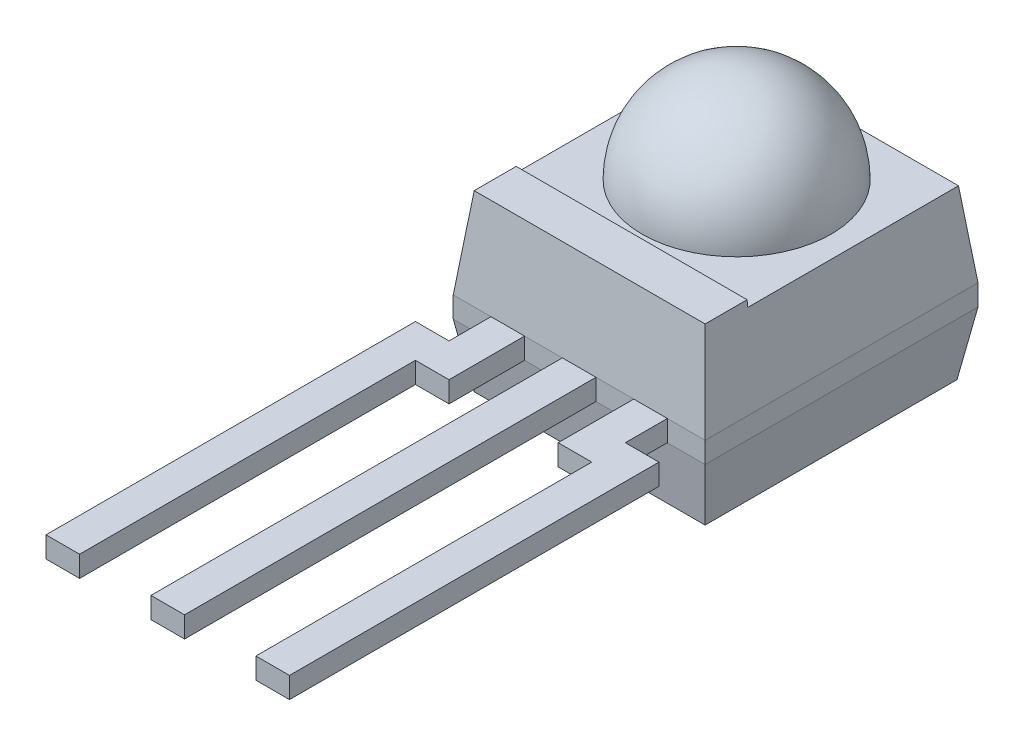
ISO-10303-21;
HEADER;
FILE_DESCRIPTION(('STEP AP214'),'2;1');
FILE_NAME('part.step','',(''),(''),'','','');
FILE_SCHEMA(('AUTOMOTIVE_DESIGN { 1 0 10303 214 1 1 1 1 }'));
ENDSEC;
DATA;
#1=APPLICATION_CONTEXT('core data for automotive mechanical design processes');
#2=APPLICATION_PROTOCOL_DEFINITION('international standard','automotive_design',2000,#1);
#3=PRODUCT_CONTEXT('',#1,'mechanical');
#4=PRODUCT('Part','Part','',(#3));
#5=PRODUCT_RELATED_PRODUCT_CATEGORY('part','',(#4));
#6=PRODUCT_DEFINITION_FORMATION('','',#4);
#7=PRODUCT_DEFINITION_CONTEXT('part definition',#1,'design');
#8=PRODUCT_DEFINITION('design','',#6,#7);
#9=PRODUCT_DEFINITION_SHAPE('','',#8);
#10=(LENGTH_UNIT() NAMED_UNIT(*) SI_UNIT(.MILLI.,.METRE.));
#11=(NAMED_UNIT(*) PLANE_ANGLE_UNIT() SI_UNIT($,.RADIAN.));
#12=(NAMED_UNIT(*) SI_UNIT($,.STERADIAN.) SOLID_ANGLE_UNIT());
#13=UNCERTAINTY_MEASURE_WITH_UNIT(LENGTH_MEASURE(1.E-05),#10,'distance_accuracy_value','');
#14=(GEOMETRIC_REPRESENTATION_CONTEXT(3) GLOBAL_UNCERTAINTY_ASSIGNED_CONTEXT((#13)) GLOBAL_UNIT_ASSIGNED_CONTEXT((#10,
#11,#12)) REPRESENTATION_CONTEXT('',''));
#15=CARTESIAN_POINT('',(0.,0.,0.));
#16=DIRECTION('',(0.,0.,1.));
#17=DIRECTION('',(1.,0.,0.));
#18=AXIS2_PLACEMENT_3D('',#15,#16,#17);
#19=CARTESIAN_POINT('',(-3.,4.,3.25));
#20=DIRECTION('',(0.,0.,-1.));
#21=DIRECTION('',(-1.,0.,0.));
#22=AXIS2_PLACEMENT_3D('',#19,#20,#21);
#23=PLANE('',#22);
#24=DIRECTION('',(0.,-1.,0.));
#25=VECTOR('',#24,1.);
#26=CARTESIAN_POINT('',(-3.,4.,3.25));
#27=LINE('',#26,#25);
#28=CARTESIAN_POINT('',(-3.,2.,3.25));
#29=VERTEX_POINT('',#28);
#30=CARTESIAN_POINT('',(-3.,1.5,3.25));
#31=VERTEX_POINT('',#30);
#32=EDGE_CURVE('E264',#29,#31,#27,.T.);
#33=ORIENTED_EDGE('',*,*,#32,.T.);
#34=DIRECTION('',(-1.,0.,0.));
#35=VECTOR('',#34,1.);
#36=CARTESIAN_POINT('',(3.,1.5,3.25));
#37=LINE('',#36,#35);
#38=CARTESIAN_POINT('',(-2.1,1.5,3.25));
#39=VERTEX_POINT('',#38);
#40=EDGE_CURVE('E251',#39,#31,#37,.T.);
#41=ORIENTED_EDGE('',*,*,#40,.F.);
#42=DIRECTION('',(0.,-1.,0.));
#43=VECTOR('',#42,1.);
#44=CARTESIAN_POINT('',(-2.1,1.5,3.25));
#45=LINE('',#44,#43);
#46=CARTESIAN_POINT('',(-2.1,2.,3.25));
#47=VERTEX_POINT('',#46);
#48=EDGE_CURVE('E487',#47,#39,#45,.T.);
#49=ORIENTED_EDGE('',*,*,#48,.F.);
#50=DIRECTION('',(-1.,0.,0.));
#51=VECTOR('',#50,1.);
#52=CARTESIAN_POINT('',(3.,2.,3.25));
#53=LINE('',#52,#51);
#54=EDGE_CURVE('E248',#47,#29,#53,.T.);
#55=ORIENTED_EDGE('',*,*,#54,.T.);
#56=EDGE_LOOP('',(#33,#41,#49,#55));
#57=FACE_BOUND('',#56,.T.);
#58=ADVANCED_FACE('F34',(#57),#23,.F.);
#59=DIRECTION('',(0.,1.,0.));
#60=VECTOR('',#59,1.);
#61=CARTESIAN_POINT('',(-1.3,1.5,3.25));
#62=LINE('',#61,#60);
#63=CARTESIAN_POINT('',(-1.3,1.5,3.25));
#64=VERTEX_POINT('',#63);
#65=CARTESIAN_POINT('',(-1.3,2.,3.25));
#66=VERTEX_POINT('',#65);
#67=EDGE_CURVE('E498',#64,#66,#62,.T.);
#68=ORIENTED_EDGE('',*,*,#67,.F.);
#69=CARTESIAN_POINT('',(-0.399999999999997,1.5,3.25));
#70=VERTEX_POINT('',#69);
#71=EDGE_CURVE('E519',#70,#64,#37,.T.);
#72=ORIENTED_EDGE('',*,*,#71,.F.);
#73=DIRECTION('',(0.,-1.,0.));
#74=VECTOR('',#73,1.);
#75=CARTESIAN_POINT('',(-0.399999999999997,1.5,3.25));
#76=LINE('',#75,#74);
#77=CARTESIAN_POINT('',(-0.399999999999996,2.,3.25));
#78=VERTEX_POINT('',#77);
#79=EDGE_CURVE('E463',#78,#70,#76,.T.);
#80=ORIENTED_EDGE('',*,*,#79,.F.);
#81=EDGE_CURVE('E596',#78,#66,#53,.T.);
#82=ORIENTED_EDGE('',*,*,#81,.T.);
#83=EDGE_LOOP('',(#68,#72,#80,#82));
#84=FACE_BOUND('',#83,.T.);
#85=ADVANCED_FACE('F561',(#84),#23,.F.);
#86=DIRECTION('',(0.,1.,0.));
#87=VECTOR('',#86,1.);
#88=CARTESIAN_POINT('',(0.400000000000005,1.5,3.25));
#89=LINE('',#88,#87);
#90=CARTESIAN_POINT('',(0.400000000000005,1.5,3.25));
#91=VERTEX_POINT('',#90);
#92=CARTESIAN_POINT('',(0.400000000000004,2.,3.25));
#93=VERTEX_POINT('',#92);
#94=EDGE_CURVE('E469',#91,#93,#89,.T.);
#95=ORIENTED_EDGE('',*,*,#94,.F.);
#96=CARTESIAN_POINT('',(1.3,1.5,3.25));
#97=VERTEX_POINT('',#96);
#98=EDGE_CURVE('E249',#97,#91,#37,.T.);
#99=ORIENTED_EDGE('',*,*,#98,.F.);
#100=DIRECTION('',(0.,-1.,0.));
#101=VECTOR('',#100,1.);
#102=CARTESIAN_POINT('',(1.3,1.5,3.25));
#103=LINE('',#102,#101);
#104=CARTESIAN_POINT('',(1.3,2.,3.25));
#105=VERTEX_POINT('',#104);
#106=EDGE_CURVE('E437',#105,#97,#103,.T.);
#107=ORIENTED_EDGE('',*,*,#106,.F.);
#108=EDGE_CURVE('E302',#105,#93,#53,.T.);
#109=ORIENTED_EDGE('',*,*,#108,.T.);
#110=EDGE_LOOP('',(#95,#99,#107,#109));
#111=FACE_BOUND('',#110,.T.);
#112=ADVANCED_FACE('F565',(#111),#23,.F.);
#113=CARTESIAN_POINT('',(0.,4.,0.));
#114=DIRECTION('',(0.,1.,0.));
#115=DIRECTION('',(0.,0.,1.));
#116=AXIS2_PLACEMENT_3D('',#113,#114,#115);
#117=PLANE('',#116);
#118=DIRECTION('',(1.,0.,0.));
#119=VECTOR('',#118,1.);
#120=CARTESIAN_POINT('',(0.,4.,-3.01744186046512));
#121=LINE('',#120,#119);
#122=CARTESIAN_POINT('',(-2.76744186046512,4.,-3.01744186046511));
#123=VERTEX_POINT('',#122);
#124=CARTESIAN_POINT('',(2.76744186046512,4.,-3.01744186046512));
#125=VERTEX_POINT('',#124);
#126=EDGE_CURVE('E49',#123,#125,#121,.T.);
#127=ORIENTED_EDGE('',*,*,#126,.F.);
#128=DIRECTION('',(0.,0.,-1.));
#129=VECTOR('',#128,1.);
#130=CARTESIAN_POINT('',(-2.76744186046512,4.,0.));
#131=LINE('',#130,#129);
#132=CARTESIAN_POINT('',(-2.76744186046512,4.,2.));
#133=VERTEX_POINT('',#132);
#134=EDGE_CURVE('E330',#133,#123,#131,.T.);
#135=ORIENTED_EDGE('',*,*,#134,.F.);
#136=DIRECTION('',(-1.,0.,0.));
#137=VECTOR('',#136,1.);
#138=CARTESIAN_POINT('',(-3.,4.,2.));
#139=LINE('',#138,#137);
#140=CARTESIAN_POINT('',(2.76744186046512,4.,2.));
#141=VERTEX_POINT('',#140);
#142=EDGE_CURVE('E338',#141,#133,#139,.T.);
#143=ORIENTED_EDGE('',*,*,#142,.F.);
#144=DIRECTION('',(0.,0.,1.));
#145=VECTOR('',#144,1.);
#146=CARTESIAN_POINT('',(2.76744186046512,4.,0.));
#147=LINE('',#146,#145);
#148=EDGE_CURVE('E336',#125,#141,#147,.T.);
#149=ORIENTED_EDGE('',*,*,#148,.F.);
#150=EDGE_LOOP('',(#127,#135,#143,#149));
#151=FACE_BOUND('',#150,.T.);
#152=CARTESIAN_POINT('',(0.,4.,-0.499999999999999));
#153=DIRECTION('',(0.,-1.,0.));
#154=DIRECTION('',(0.,0.,1.));
#155=AXIS2_PLACEMENT_3D('',#152,#153,#154);
#156=CIRCLE('',#155,2.25);
#157=CARTESIAN_POINT('',(0.,4.,1.75));
#158=VERTEX_POINT('',#157);
#159=EDGE_CURVE('E341',#158,#158,#156,.T.);
#160=ORIENTED_EDGE('',*,*,#159,.T.);
#161=EDGE_LOOP('',(#160));
#162=FACE_BOUND('',#161,.T.);
#163=ADVANCED_FACE('F568',(#151,#162),#117,.T.);
#164=DIRECTION('',(0.,1.,0.));
#165=VECTOR('',#164,1.);
#166=CARTESIAN_POINT('',(2.1,1.5,3.25));
#167=LINE('',#166,#165);
#168=CARTESIAN_POINT('',(2.1,1.5,3.25));
#169=VERTEX_POINT('',#168);
#170=CARTESIAN_POINT('',(2.1,2.,3.25));
#171=VERTEX_POINT('',#170);
#172=EDGE_CURVE('E246',#169,#171,#167,.T.);
#173=ORIENTED_EDGE('',*,*,#172,.F.);
#174=CARTESIAN_POINT('',(3.,1.5,3.25));
#175=VERTEX_POINT('',#174);
#176=EDGE_CURVE('E230',#175,#169,#37,.T.);
#177=ORIENTED_EDGE('',*,*,#176,.F.);
#178=DIRECTION('',(0.,-1.,0.));
#179=VECTOR('',#178,1.);
#180=CARTESIAN_POINT('',(3.,4.,3.25));
#181=LINE('',#180,#179);
#182=CARTESIAN_POINT('',(3.,2.,3.25));
#183=VERTEX_POINT('',#182);
#184=EDGE_CURVE('E244',#183,#175,#181,.T.);
#185=ORIENTED_EDGE('',*,*,#184,.F.);
#186=EDGE_CURVE('E293',#183,#171,#53,.T.);
#187=ORIENTED_EDGE('',*,*,#186,.T.);
#188=EDGE_LOOP('',(#173,#177,#185,#187));
#189=FACE_BOUND('',#188,.T.);
#190=ADVANCED_FACE('F241',(#189),#23,.F.);
#191=CARTESIAN_POINT('',(3.,4.,-3.25));
#192=DIRECTION('',(-1.,0.,0.));
#193=DIRECTION('',(0.,0.,1.));
#194=AXIS2_PLACEMENT_3D('',#191,#192,#193);
#195=PLANE('',#194);
#196=DIRECTION('',(0.,-1.,0.));
#197=VECTOR('',#196,1.);
#198=CARTESIAN_POINT('',(3.,4.,-3.25));
#199=LINE('',#198,#197);
#200=CARTESIAN_POINT('',(3.,2.,-3.25));
#201=VERTEX_POINT('',#200);
#202=CARTESIAN_POINT('',(3.,1.5,-3.25));
#203=VERTEX_POINT('',#202);
#204=EDGE_CURVE('E277',#201,#203,#199,.T.);
#205=ORIENTED_EDGE('',*,*,#204,.F.);
#206=DIRECTION('',(0.,0.,1.));
#207=VECTOR('',#206,1.);
#208=CARTESIAN_POINT('',(3.,2.,-3.25));
#209=LINE('',#208,#207);
#210=EDGE_CURVE('E260',#201,#183,#209,.T.);
#211=ORIENTED_EDGE('',*,*,#210,.T.);
#212=ORIENTED_EDGE('',*,*,#184,.T.);
#213=DIRECTION('',(0.,0.,1.));
#214=VECTOR('',#213,1.);
#215=CARTESIAN_POINT('',(3.,1.5,-3.25));
#216=LINE('',#215,#214);
#217=EDGE_CURVE('E254',#203,#175,#216,.T.);
#218=ORIENTED_EDGE('',*,*,#217,.F.);
#219=EDGE_LOOP('',(#205,#211,#212,#218));
#220=FACE_BOUND('',#219,.T.);
#221=ADVANCED_FACE('F36',(#220),#195,.F.);
#222=CARTESIAN_POINT('',(-3.,4.,-3.25));
#223=DIRECTION('',(0.,0.,1.));
#224=DIRECTION('',(1.,0.,0.));
#225=AXIS2_PLACEMENT_3D('',#222,#223,#224);
#226=PLANE('',#225);
#227=DIRECTION('',(0.,-1.,0.));
#228=VECTOR('',#227,1.);
#229=CARTESIAN_POINT('',(-3.,4.,-3.25));
#230=LINE('',#229,#228);
#231=CARTESIAN_POINT('',(-3.,2.,-3.25));
#232=VERTEX_POINT('',#231);
#233=CARTESIAN_POINT('',(-3.,1.5,-3.25));
#234=VERTEX_POINT('',#233);
#235=EDGE_CURVE('E268',#232,#234,#230,.T.);
#236=ORIENTED_EDGE('',*,*,#235,.F.);
#237=DIRECTION('',(-1.,0.,0.));
#238=VECTOR('',#237,1.);
#239=CARTESIAN_POINT('',(3.,2.,-3.25));
#240=LINE('',#239,#238);
#241=EDGE_CURVE('E305',#201,#232,#240,.T.);
#242=ORIENTED_EDGE('',*,*,#241,.F.);
#243=ORIENTED_EDGE('',*,*,#204,.T.);
#244=DIRECTION('',(-1.,0.,0.));
#245=VECTOR('',#244,1.);
#246=CARTESIAN_POINT('',(3.,1.5,-3.25));
#247=LINE('',#246,#245);
#248=EDGE_CURVE('E524',#203,#234,#247,.T.);
#249=ORIENTED_EDGE('',*,*,#248,.T.);
#250=EDGE_LOOP('',(#236,#242,#243,#249));
#251=FACE_BOUND('',#250,.T.);
#252=ADVANCED_FACE('F541',(#251),#226,.F.);
#253=CARTESIAN_POINT('',(-3.,4.,-3.25));
#254=DIRECTION('',(1.,0.,0.));
#255=DIRECTION('',(0.,0.,-1.));
#256=AXIS2_PLACEMENT_3D('',#253,#254,#255);
#257=PLANE('',#256);
#258=ORIENTED_EDGE('',*,*,#235,.T.);
#259=DIRECTION('',(0.,0.,1.));
#260=VECTOR('',#259,1.);
#261=CARTESIAN_POINT('',(-3.,1.5,-3.25));
#262=LINE('',#261,#260);
#263=EDGE_CURVE('E316',#234,#31,#262,.T.);
#264=ORIENTED_EDGE('',*,*,#263,.T.);
#265=ORIENTED_EDGE('',*,*,#32,.F.);
#266=DIRECTION('',(0.,0.,1.));
#267=VECTOR('',#266,1.);
#268=CARTESIAN_POINT('',(-3.,2.,-3.25));
#269=LINE('',#268,#267);
#270=EDGE_CURVE('E319',#232,#29,#269,.T.);
#271=ORIENTED_EDGE('',*,*,#270,.F.);
#272=EDGE_LOOP('',(#258,#264,#265,#271));
#273=FACE_BOUND('',#272,.T.);
#274=ADVANCED_FACE('F540',(#273),#257,.F.);
#275=CARTESIAN_POINT('',(0.,0.,0.));
#276=DIRECTION('',(0.,1.,0.));
#277=DIRECTION('',(0.,0.,1.));
#278=AXIS2_PLACEMENT_3D('',#275,#276,#277);
#279=PLANE('',#278);
#280=DIRECTION('',(0.,0.,1.));
#281=VECTOR('',#280,1.);
#282=CARTESIAN_POINT('',(-2.75,0.,-3.25));
#283=LINE('',#282,#281);
#284=CARTESIAN_POINT('',(-2.75,0.,-3.));
#285=VERTEX_POINT('',#284);
#286=CARTESIAN_POINT('',(-2.75,0.,3.));
#287=VERTEX_POINT('',#286);
#288=EDGE_CURVE('E320',#285,#287,#283,.T.);
#289=ORIENTED_EDGE('',*,*,#288,.F.);
#290=DIRECTION('',(-1.,0.,0.));
#291=VECTOR('',#290,1.);
#292=CARTESIAN_POINT('',(3.,0.,-3.));
#293=LINE('',#292,#291);
#294=CARTESIAN_POINT('',(2.75,0.,-3.));
#295=VERTEX_POINT('',#294);
#296=EDGE_CURVE('E528',#295,#285,#293,.T.);
#297=ORIENTED_EDGE('',*,*,#296,.F.);
#298=DIRECTION('',(0.,0.,1.));
#299=VECTOR('',#298,1.);
#300=CARTESIAN_POINT('',(2.75,0.,-3.25));
#301=LINE('',#300,#299);
#302=CARTESIAN_POINT('',(2.75,0.,3.));
#303=VERTEX_POINT('',#302);
#304=EDGE_CURVE('E259',#295,#303,#301,.T.);
#305=ORIENTED_EDGE('',*,*,#304,.T.);
#306=DIRECTION('',(-1.,0.,0.));
#307=VECTOR('',#306,1.);
#308=CARTESIAN_POINT('',(3.,0.,3.));
#309=LINE('',#308,#307);
#310=EDGE_CURVE('E56',#303,#287,#309,.T.);
#311=ORIENTED_EDGE('',*,*,#310,.T.);
#312=EDGE_LOOP('',(#289,#297,#305,#311));
#313=FACE_BOUND('',#312,.T.);
#314=ADVANCED_FACE('F547',(#313),#279,.F.);
#315=CARTESIAN_POINT('',(-2.1,1.5,4.25));
#316=DIRECTION('',(1.,0.,0.));
#317=DIRECTION('',(0.,0.,-1.));
#318=AXIS2_PLACEMENT_3D('',#315,#316,#317);
#319=PLANE('',#318);
#320=ORIENTED_EDGE('',*,*,#48,.T.);
#321=DIRECTION('',(0.,0.,-1.));
#322=VECTOR('',#321,1.);
#323=CARTESIAN_POINT('',(-2.1,1.5,4.25));
#324=LINE('',#323,#322);
#325=CARTESIAN_POINT('',(-2.1,1.5,4.25));
#326=VERTEX_POINT('',#325);
#327=EDGE_CURVE('E265',#326,#39,#324,.T.);
#328=ORIENTED_EDGE('',*,*,#327,.F.);
#329=DIRECTION('',(0.,-1.,0.));
#330=VECTOR('',#329,1.);
#331=CARTESIAN_POINT('',(-2.1,1.5,4.25));
#332=LINE('',#331,#330);
#333=CARTESIAN_POINT('',(-2.1,2.,4.25));
#334=VERTEX_POINT('',#333);
#335=EDGE_CURVE('E488',#334,#326,#332,.T.);
#336=ORIENTED_EDGE('',*,*,#335,.F.);
#337=DIRECTION('',(0.,0.,-1.));
#338=VECTOR('',#337,1.);
#339=CARTESIAN_POINT('',(-2.1,2.,4.25));
#340=LINE('',#339,#338);
#341=EDGE_CURVE('E491',#334,#47,#340,.T.);
#342=ORIENTED_EDGE('',*,*,#341,.T.);
#343=EDGE_LOOP('',(#320,#328,#336,#342));
#344=FACE_BOUND('',#343,.T.);
#345=ADVANCED_FACE('F549',(#344),#319,.F.);
#346=CARTESIAN_POINT('',(-2.1,1.5,4.25));
#347=DIRECTION('',(0.,1.,0.));
#348=DIRECTION('',(0.,0.,1.));
#349=AXIS2_PLACEMENT_3D('',#346,#347,#348);
#350=PLANE('',#349);
#351=DIRECTION('',(1.,0.,0.));
#352=VECTOR('',#351,1.);
#353=CARTESIAN_POINT('',(-2.1,1.5,3.25));
#354=LINE('',#353,#352);
#355=EDGE_CURVE('E495',#39,#64,#354,.T.);
#356=ORIENTED_EDGE('',*,*,#355,.T.);
#357=DIRECTION('',(0.,0.,-1.));
#358=VECTOR('',#357,1.);
#359=CARTESIAN_POINT('',(-1.3,1.5,4.25));
#360=LINE('',#359,#358);
#361=CARTESIAN_POINT('',(-1.3,1.5,5.05));
#362=VERTEX_POINT('',#361);
#363=EDGE_CURVE('E271',#362,#64,#360,.T.);
#364=ORIENTED_EDGE('',*,*,#363,.F.);
#365=DIRECTION('',(1.,0.,0.));
#366=VECTOR('',#365,1.);
#367=CARTESIAN_POINT('',(-1.3,1.5,5.05));
#368=LINE('',#367,#366);
#369=CARTESIAN_POINT('',(-2.1,1.5,5.05));
#370=VERTEX_POINT('',#369);
#371=EDGE_CURVE('E400',#370,#362,#368,.T.);
#372=ORIENTED_EDGE('',*,*,#371,.F.);
#373=DIRECTION('',(0.,0.,-1.));
#374=VECTOR('',#373,1.);
#375=CARTESIAN_POINT('',(-2.1,1.5,5.05));
#376=LINE('',#375,#374);
#377=CARTESIAN_POINT('',(-2.1,1.5,13.05));
#378=VERTEX_POINT('',#377);
#379=EDGE_CURVE('E397',#378,#370,#376,.T.);
#380=ORIENTED_EDGE('',*,*,#379,.F.);
#381=DIRECTION('',(1.,0.,0.));
#382=VECTOR('',#381,1.);
#383=CARTESIAN_POINT('',(-2.1,1.5,13.05));
#384=LINE('',#383,#382);
#385=CARTESIAN_POINT('',(-2.9,1.5,13.05));
#386=VERTEX_POINT('',#385);
#387=EDGE_CURVE('E394',#386,#378,#384,.T.);
#388=ORIENTED_EDGE('',*,*,#387,.F.);
#389=DIRECTION('',(0.,0.,1.));
#390=VECTOR('',#389,1.);
#391=CARTESIAN_POINT('',(-2.9,1.5,4.25));
#392=LINE('',#391,#390);
#393=CARTESIAN_POINT('',(-2.9,1.5,4.25));
#394=VERTEX_POINT('',#393);
#395=EDGE_CURVE('E390',#394,#386,#392,.T.);
#396=ORIENTED_EDGE('',*,*,#395,.F.);
#397=DIRECTION('',(-1.,0.,0.));
#398=VECTOR('',#397,1.);
#399=CARTESIAN_POINT('',(-1.3,1.5,4.25));
#400=LINE('',#399,#398);
#401=EDGE_CURVE('E388',#326,#394,#400,.T.);
#402=ORIENTED_EDGE('',*,*,#401,.F.);
#403=ORIENTED_EDGE('',*,*,#327,.T.);
#404=EDGE_LOOP('',(#356,#364,#372,#380,#388,#396,#402,#403));
#405=FACE_BOUND('',#404,.T.);
#406=ADVANCED_FACE('F514',(#405),#350,.F.);
#407=CARTESIAN_POINT('',(-1.3,1.5,4.25));
#408=DIRECTION('',(-1.,0.,0.));
#409=DIRECTION('',(0.,-1.,0.));
#410=AXIS2_PLACEMENT_3D('',#407,#408,#409);
#411=PLANE('',#410);
#412=ORIENTED_EDGE('',*,*,#67,.T.);
#413=DIRECTION('',(0.,0.,-1.));
#414=VECTOR('',#413,1.);
#415=CARTESIAN_POINT('',(-1.3,2.,4.25));
#416=LINE('',#415,#414);
#417=CARTESIAN_POINT('',(-1.3,2.,5.05));
#418=VERTEX_POINT('',#417);
#419=EDGE_CURVE('E505',#418,#66,#416,.T.);
#420=ORIENTED_EDGE('',*,*,#419,.F.);
#421=DIRECTION('',(0.,1.,0.));
#422=VECTOR('',#421,1.);
#423=CARTESIAN_POINT('',(-1.3,1.5,5.05));
#424=LINE('',#423,#422);
#425=EDGE_CURVE('E416',#362,#418,#424,.T.);
#426=ORIENTED_EDGE('',*,*,#425,.F.);
#427=ORIENTED_EDGE('',*,*,#363,.T.);
#428=EDGE_LOOP('',(#412,#420,#426,#427));
#429=FACE_BOUND('',#428,.T.);
#430=ADVANCED_FACE('F510',(#429),#411,.F.);
#431=CARTESIAN_POINT('',(-2.1,2.,4.25));
#432=DIRECTION('',(0.,-1.,0.));
#433=DIRECTION('',(0.,0.,-1.));
#434=AXIS2_PLACEMENT_3D('',#431,#432,#433);
#435=PLANE('',#434);
#436=DIRECTION('',(-1.,0.,0.));
#437=VECTOR('',#436,1.);
#438=CARTESIAN_POINT('',(-2.1,2.,3.25));
#439=LINE('',#438,#437);
#440=EDGE_CURVE('E492',#66,#47,#439,.T.);
#441=ORIENTED_EDGE('',*,*,#440,.T.);
#442=ORIENTED_EDGE('',*,*,#341,.F.);
#443=DIRECTION('',(-1.,0.,0.));
#444=VECTOR('',#443,1.);
#445=CARTESIAN_POINT('',(-2.1,2.,4.25));
#446=LINE('',#445,#444);
#447=CARTESIAN_POINT('',(-2.9,2.,4.25));
#448=VERTEX_POINT('',#447);
#449=EDGE_CURVE('E379',#334,#448,#446,.T.);
#450=ORIENTED_EDGE('',*,*,#449,.T.);
#451=DIRECTION('',(0.,0.,1.));
#452=VECTOR('',#451,1.);
#453=CARTESIAN_POINT('',(-2.9,2.,4.25));
#454=LINE('',#453,#452);
#455=CARTESIAN_POINT('',(-2.9,2.,13.05));
#456=VERTEX_POINT('',#455);
#457=EDGE_CURVE('E405',#448,#456,#454,.T.);
#458=ORIENTED_EDGE('',*,*,#457,.T.);
#459=DIRECTION('',(1.,0.,0.));
#460=VECTOR('',#459,1.);
#461=CARTESIAN_POINT('',(-2.1,2.,13.05));
#462=LINE('',#461,#460);
#463=CARTESIAN_POINT('',(-2.1,2.,13.05));
#464=VERTEX_POINT('',#463);
#465=EDGE_CURVE('E408',#456,#464,#462,.T.);
#466=ORIENTED_EDGE('',*,*,#465,.T.);
#467=DIRECTION('',(0.,0.,-1.));
#468=VECTOR('',#467,1.);
#469=CARTESIAN_POINT('',(-2.1,2.,5.05));
#470=LINE('',#469,#468);
#471=CARTESIAN_POINT('',(-2.1,2.,5.05));
#472=VERTEX_POINT('',#471);
#473=EDGE_CURVE('E411',#464,#472,#470,.T.);
#474=ORIENTED_EDGE('',*,*,#473,.T.);
#475=DIRECTION('',(1.,0.,0.));
#476=VECTOR('',#475,1.);
#477=CARTESIAN_POINT('',(-1.3,2.,5.05));
#478=LINE('',#477,#476);
#479=EDGE_CURVE('E391',#472,#418,#478,.T.);
#480=ORIENTED_EDGE('',*,*,#479,.T.);
#481=ORIENTED_EDGE('',*,*,#419,.T.);
#482=EDGE_LOOP('',(#441,#442,#450,#458,#466,#474,#480,#481));
#483=FACE_BOUND('',#482,.T.);
#484=ADVANCED_FACE('F682',(#483),#435,.F.);
#485=CARTESIAN_POINT('',(-0.399999999999997,1.5,4.25));
#486=DIRECTION('',(1.,0.,0.));
#487=DIRECTION('',(0.,1.,0.));
#488=AXIS2_PLACEMENT_3D('',#485,#486,#487);
#489=PLANE('',#488);
#490=ORIENTED_EDGE('',*,*,#79,.T.);
#491=DIRECTION('',(0.,0.,-1.));
#492=VECTOR('',#491,1.);
#493=CARTESIAN_POINT('',(-0.399999999999997,1.5,4.25));
#494=LINE('',#493,#492);
#495=CARTESIAN_POINT('',(-0.399999999999995,1.5,13.05));
#496=VERTEX_POINT('',#495);
#497=EDGE_CURVE('E484',#496,#70,#494,.T.);
#498=ORIENTED_EDGE('',*,*,#497,.F.);
#499=DIRECTION('',(0.,1.,0.));
#500=VECTOR('',#499,1.);
#501=CARTESIAN_POINT('',(-0.399999999999995,1.5,13.05));
#502=LINE('',#501,#500);
#503=CARTESIAN_POINT('',(-0.399999999999995,2.,13.05));
#504=VERTEX_POINT('',#503);
#505=EDGE_CURVE('E431',#496,#504,#502,.T.);
#506=ORIENTED_EDGE('',*,*,#505,.T.);
#507=DIRECTION('',(0.,0.,-1.));
#508=VECTOR('',#507,1.);
#509=CARTESIAN_POINT('',(-0.399999999999996,2.,4.25));
#510=LINE('',#509,#508);
#511=EDGE_CURVE('E475',#504,#78,#510,.T.);
#512=ORIENTED_EDGE('',*,*,#511,.T.);
#513=EDGE_LOOP('',(#490,#498,#506,#512));
#514=FACE_BOUND('',#513,.T.);
#515=ADVANCED_FACE('F593',(#514),#489,.F.);
#516=CARTESIAN_POINT('',(-0.399999999999997,1.5,4.25));
#517=DIRECTION('',(0.,1.,0.));
#518=DIRECTION('',(0.,0.,1.));
#519=AXIS2_PLACEMENT_3D('',#516,#517,#518);
#520=PLANE('',#519);
#521=DIRECTION('',(1.,0.,0.));
#522=VECTOR('',#521,1.);
#523=CARTESIAN_POINT('',(-0.399999999999997,1.5,3.25));
#524=LINE('',#523,#522);
#525=EDGE_CURVE('E466',#70,#91,#524,.T.);
#526=ORIENTED_EDGE('',*,*,#525,.T.);
#527=DIRECTION('',(0.,0.,-1.));
#528=VECTOR('',#527,1.);
#529=CARTESIAN_POINT('',(0.400000000000005,1.5,4.25));
#530=LINE('',#529,#528);
#531=CARTESIAN_POINT('',(0.400000000000004,1.5,13.05));
#532=VERTEX_POINT('',#531);
#533=EDGE_CURVE('E481',#532,#91,#530,.T.);
#534=ORIENTED_EDGE('',*,*,#533,.F.);
#535=DIRECTION('',(1.,0.,0.));
#536=VECTOR('',#535,1.);
#537=CARTESIAN_POINT('',(-0.399999999999995,1.5,13.05));
#538=LINE('',#537,#536);
#539=EDGE_CURVE('E428',#496,#532,#538,.T.);
#540=ORIENTED_EDGE('',*,*,#539,.F.);
#541=ORIENTED_EDGE('',*,*,#497,.T.);
#542=EDGE_LOOP('',(#526,#534,#540,#541));
#543=FACE_BOUND('',#542,.T.);
#544=ADVANCED_FACE('F584',(#543),#520,.F.);
#545=CARTESIAN_POINT('',(0.400000000000005,1.5,4.25));
#546=DIRECTION('',(-1.,0.,0.));
#547=DIRECTION('',(0.,-1.,0.));
#548=AXIS2_PLACEMENT_3D('',#545,#546,#547);
#549=PLANE('',#548);
#550=ORIENTED_EDGE('',*,*,#94,.T.);
#551=DIRECTION('',(0.,0.,-1.));
#552=VECTOR('',#551,1.);
#553=CARTESIAN_POINT('',(0.400000000000003,2.,4.25));
#554=LINE('',#553,#552);
#555=CARTESIAN_POINT('',(0.400000000000004,2.,13.05));
#556=VERTEX_POINT('',#555);
#557=EDGE_CURVE('E478',#556,#93,#554,.T.);
#558=ORIENTED_EDGE('',*,*,#557,.F.);
#559=DIRECTION('',(0.,1.,0.));
#560=VECTOR('',#559,1.);
#561=CARTESIAN_POINT('',(0.400000000000004,1.5,13.05));
#562=LINE('',#561,#560);
#563=EDGE_CURVE('E434',#532,#556,#562,.T.);
#564=ORIENTED_EDGE('',*,*,#563,.F.);
#565=ORIENTED_EDGE('',*,*,#533,.T.);
#566=EDGE_LOOP('',(#550,#558,#564,#565));
#567=FACE_BOUND('',#566,.T.);
#568=ADVANCED_FACE('F587',(#567),#549,.F.);
#569=CARTESIAN_POINT('',(-0.399999999999996,2.,4.25));
#570=DIRECTION('',(0.,-1.,0.));
#571=DIRECTION('',(0.,0.,-1.));
#572=AXIS2_PLACEMENT_3D('',#569,#570,#571);
#573=PLANE('',#572);
#574=DIRECTION('',(-1.,0.,0.));
#575=VECTOR('',#574,1.);
#576=CARTESIAN_POINT('',(-0.399999999999996,2.,3.25));
#577=LINE('',#576,#575);
#578=EDGE_CURVE('E472',#93,#78,#577,.T.);
#579=ORIENTED_EDGE('',*,*,#578,.T.);
#580=ORIENTED_EDGE('',*,*,#511,.F.);
#581=DIRECTION('',(1.,0.,0.));
#582=VECTOR('',#581,1.);
#583=CARTESIAN_POINT('',(-0.399999999999995,2.,13.05));
#584=LINE('',#583,#582);
#585=EDGE_CURVE('E419',#504,#556,#584,.T.);
#586=ORIENTED_EDGE('',*,*,#585,.T.);
#587=ORIENTED_EDGE('',*,*,#557,.T.);
#588=EDGE_LOOP('',(#579,#580,#586,#587));
#589=FACE_BOUND('',#588,.T.);
#590=ADVANCED_FACE('F598',(#589),#573,.F.);
#591=CARTESIAN_POINT('',(1.3,1.5,4.25));
#592=DIRECTION('',(1.,0.,0.));
#593=DIRECTION('',(0.,1.,0.));
#594=AXIS2_PLACEMENT_3D('',#591,#592,#593);
#595=PLANE('',#594);
#596=ORIENTED_EDGE('',*,*,#106,.T.);
#597=DIRECTION('',(0.,0.,-1.));
#598=VECTOR('',#597,1.);
#599=CARTESIAN_POINT('',(1.3,1.5,4.25));
#600=LINE('',#599,#598);
#601=CARTESIAN_POINT('',(1.3,1.5,5.05));
#602=VERTEX_POINT('',#601);
#603=EDGE_CURVE('E460',#602,#97,#600,.T.);
#604=ORIENTED_EDGE('',*,*,#603,.F.);
#605=DIRECTION('',(0.,1.,0.));
#606=VECTOR('',#605,1.);
#607=CARTESIAN_POINT('',(1.3,1.5,5.05));
#608=LINE('',#607,#606);
#609=CARTESIAN_POINT('',(1.3,2.,5.05));
#610=VERTEX_POINT('',#609);
#611=EDGE_CURVE('E382',#602,#610,#608,.T.);
#612=ORIENTED_EDGE('',*,*,#611,.T.);
#613=DIRECTION('',(0.,0.,-1.));
#614=VECTOR('',#613,1.);
#615=CARTESIAN_POINT('',(1.3,2.,4.25));
#616=LINE('',#615,#614);
#617=EDGE_CURVE('E443',#610,#105,#616,.T.);
#618=ORIENTED_EDGE('',*,*,#617,.T.);
#619=EDGE_LOOP('',(#596,#604,#612,#618));
#620=FACE_BOUND('',#619,.T.);
#621=ADVANCED_FACE('F669',(#620),#595,.F.);
#622=CARTESIAN_POINT('',(1.3,1.5,4.25));
#623=DIRECTION('',(0.,1.,0.));
#624=DIRECTION('',(0.,0.,1.));
#625=AXIS2_PLACEMENT_3D('',#622,#623,#624);
#626=PLANE('',#625);
#627=DIRECTION('',(1.,0.,0.));
#628=VECTOR('',#627,1.);
#629=CARTESIAN_POINT('',(1.3,1.5,3.25));
#630=LINE('',#629,#628);
#631=EDGE_CURVE('E447',#97,#169,#630,.T.);
#632=ORIENTED_EDGE('',*,*,#631,.T.);
#633=DIRECTION('',(0.,0.,-1.));
#634=VECTOR('',#633,1.);
#635=CARTESIAN_POINT('',(2.1,1.5,4.25));
#636=LINE('',#635,#634);
#637=CARTESIAN_POINT('',(2.1,1.5,4.25));
#638=VERTEX_POINT('',#637);
#639=EDGE_CURVE('E457',#638,#169,#636,.T.);
#640=ORIENTED_EDGE('',*,*,#639,.F.);
#641=DIRECTION('',(-1.,0.,0.));
#642=VECTOR('',#641,1.);
#643=CARTESIAN_POINT('',(1.3,1.5,4.25));
#644=LINE('',#643,#642);
#645=CARTESIAN_POINT('',(2.89999999999999,1.5,4.25));
#646=VERTEX_POINT('',#645);
#647=EDGE_CURVE('E354',#646,#638,#644,.T.);
#648=ORIENTED_EDGE('',*,*,#647,.F.);
#649=DIRECTION('',(0.,0.,-1.));
#650=VECTOR('',#649,1.);
#651=CARTESIAN_POINT('',(2.89999999999999,1.5,4.25));
#652=LINE('',#651,#650);
#653=CARTESIAN_POINT('',(2.9,1.5,13.05));
#654=VERTEX_POINT('',#653);
#655=EDGE_CURVE('E350',#654,#646,#652,.T.);
#656=ORIENTED_EDGE('',*,*,#655,.F.);
#657=DIRECTION('',(1.,0.,0.));
#658=VECTOR('',#657,1.);
#659=CARTESIAN_POINT('',(2.9,1.5,13.05));
#660=LINE('',#659,#658);
#661=CARTESIAN_POINT('',(2.1,1.5,13.05));
#662=VERTEX_POINT('',#661);
#663=EDGE_CURVE('E347',#662,#654,#660,.T.);
#664=ORIENTED_EDGE('',*,*,#663,.F.);
#665=DIRECTION('',(0.,0.,1.));
#666=VECTOR('',#665,1.);
#667=CARTESIAN_POINT('',(2.1,1.5,13.05));
#668=LINE('',#667,#666);
#669=CARTESIAN_POINT('',(2.1,1.5,5.05));
#670=VERTEX_POINT('',#669);
#671=EDGE_CURVE('E360',#670,#662,#668,.T.);
#672=ORIENTED_EDGE('',*,*,#671,.F.);
#673=DIRECTION('',(1.,0.,0.));
#674=VECTOR('',#673,1.);
#675=CARTESIAN_POINT('',(2.1,1.5,5.05));
#676=LINE('',#675,#674);
#677=EDGE_CURVE('E357',#602,#670,#676,.T.);
#678=ORIENTED_EDGE('',*,*,#677,.F.);
#679=ORIENTED_EDGE('',*,*,#603,.T.);
#680=EDGE_LOOP('',(#632,#640,#648,#656,#664,#672,#678,#679));
#681=FACE_BOUND('',#680,.T.);
#682=ADVANCED_FACE('F665',(#681),#626,.F.);
#683=CARTESIAN_POINT('',(2.1,1.5,4.25));
#684=DIRECTION('',(-1.,0.,0.));
#685=DIRECTION('',(0.,-1.,0.));
#686=AXIS2_PLACEMENT_3D('',#683,#684,#685);
#687=PLANE('',#686);
#688=ORIENTED_EDGE('',*,*,#172,.T.);
#689=DIRECTION('',(0.,0.,-1.));
#690=VECTOR('',#689,1.);
#691=CARTESIAN_POINT('',(2.1,2.,4.25));
#692=LINE('',#691,#690);
#693=CARTESIAN_POINT('',(2.1,2.,4.25));
#694=VERTEX_POINT('',#693);
#695=EDGE_CURVE('E454',#694,#171,#692,.T.);
#696=ORIENTED_EDGE('',*,*,#695,.F.);
#697=DIRECTION('',(0.,1.,0.));
#698=VECTOR('',#697,1.);
#699=CARTESIAN_POINT('',(2.1,1.5,4.25));
#700=LINE('',#699,#698);
#701=EDGE_CURVE('E440',#638,#694,#700,.T.);
#702=ORIENTED_EDGE('',*,*,#701,.F.);
#703=ORIENTED_EDGE('',*,*,#639,.T.);
#704=EDGE_LOOP('',(#688,#696,#702,#703));
#705=FACE_BOUND('',#704,.T.);
#706=ADVANCED_FACE('F661',(#705),#687,.F.);
#707=CARTESIAN_POINT('',(1.3,2.,4.25));
#708=DIRECTION('',(0.,-1.,0.));
#709=DIRECTION('',(0.,0.,-1.));
#710=AXIS2_PLACEMENT_3D('',#707,#708,#709);
#711=PLANE('',#710);
#712=DIRECTION('',(-1.,0.,0.));
#713=VECTOR('',#712,1.);
#714=CARTESIAN_POINT('',(1.3,2.,3.25));
#715=LINE('',#714,#713);
#716=EDGE_CURVE('E444',#171,#105,#715,.T.);
#717=ORIENTED_EDGE('',*,*,#716,.T.);
#718=ORIENTED_EDGE('',*,*,#617,.F.);
#719=DIRECTION('',(1.,0.,0.));
#720=VECTOR('',#719,1.);
#721=CARTESIAN_POINT('',(2.1,2.,5.05));
#722=LINE('',#721,#720);
#723=CARTESIAN_POINT('',(2.1,2.,5.05));
#724=VERTEX_POINT('',#723);
#725=EDGE_CURVE('E372',#610,#724,#722,.T.);
#726=ORIENTED_EDGE('',*,*,#725,.T.);
#727=DIRECTION('',(0.,0.,1.));
#728=VECTOR('',#727,1.);
#729=CARTESIAN_POINT('',(2.1,2.,13.05));
#730=LINE('',#729,#728);
#731=CARTESIAN_POINT('',(2.1,2.,13.05));
#732=VERTEX_POINT('',#731);
#733=EDGE_CURVE('E351',#724,#732,#730,.T.);
#734=ORIENTED_EDGE('',*,*,#733,.T.);
#735=DIRECTION('',(1.,0.,0.));
#736=VECTOR('',#735,1.);
#737=CARTESIAN_POINT('',(2.9,2.,13.05));
#738=LINE('',#737,#736);
#739=CARTESIAN_POINT('',(2.9,2.,13.05));
#740=VERTEX_POINT('',#739);
#741=EDGE_CURVE('E346',#732,#740,#738,.T.);
#742=ORIENTED_EDGE('',*,*,#741,.T.);
#743=DIRECTION('',(0.,0.,-1.));
#744=VECTOR('',#743,1.);
#745=CARTESIAN_POINT('',(2.89999999999999,2.,4.25));
#746=LINE('',#745,#744);
#747=CARTESIAN_POINT('',(2.89999999999999,2.,4.25));
#748=VERTEX_POINT('',#747);
#749=EDGE_CURVE('E366',#740,#748,#746,.T.);
#750=ORIENTED_EDGE('',*,*,#749,.T.);
#751=DIRECTION('',(-1.,0.,0.));
#752=VECTOR('',#751,1.);
#753=CARTESIAN_POINT('',(1.3,2.,4.25));
#754=LINE('',#753,#752);
#755=EDGE_CURVE('E369',#748,#694,#754,.T.);
#756=ORIENTED_EDGE('',*,*,#755,.T.);
#757=ORIENTED_EDGE('',*,*,#695,.T.);
#758=EDGE_LOOP('',(#717,#718,#726,#734,#742,#750,#756,#757));
#759=FACE_BOUND('',#758,.T.);
#760=ADVANCED_FACE('F658',(#759),#711,.F.);
#761=CARTESIAN_POINT('',(-0.399999999999995,1.5,13.05));
#762=DIRECTION('',(0.,0.,1.));
#763=DIRECTION('',(1.,0.,0.));
#764=AXIS2_PLACEMENT_3D('',#761,#762,#763);
#765=PLANE('',#764);
#766=ORIENTED_EDGE('',*,*,#585,.F.);
#767=ORIENTED_EDGE('',*,*,#505,.F.);
#768=ORIENTED_EDGE('',*,*,#539,.T.);
#769=ORIENTED_EDGE('',*,*,#563,.T.);
#770=EDGE_LOOP('',(#766,#767,#768,#769));
#771=FACE_BOUND('',#770,.T.);
#772=ADVANCED_FACE('F591',(#771),#765,.T.);
#773=CARTESIAN_POINT('',(-1.3,1.5,5.05));
#774=DIRECTION('',(0.,0.,1.));
#775=DIRECTION('',(1.,0.,0.));
#776=AXIS2_PLACEMENT_3D('',#773,#774,#775);
#777=PLANE('',#776);
#778=ORIENTED_EDGE('',*,*,#479,.F.);
#779=DIRECTION('',(0.,1.,0.));
#780=VECTOR('',#779,1.);
#781=CARTESIAN_POINT('',(-2.1,1.5,5.05));
#782=LINE('',#781,#780);
#783=EDGE_CURVE('E420',#370,#472,#782,.T.);
#784=ORIENTED_EDGE('',*,*,#783,.F.);
#785=ORIENTED_EDGE('',*,*,#371,.T.);
#786=ORIENTED_EDGE('',*,*,#425,.T.);
#787=EDGE_LOOP('',(#778,#784,#785,#786));
#788=FACE_BOUND('',#787,.T.);
#789=ADVANCED_FACE('F637',(#788),#777,.T.);
#790=CARTESIAN_POINT('',(-2.1,1.5,5.05));
#791=DIRECTION('',(1.,0.,0.));
#792=DIRECTION('',(0.,0.,-1.));
#793=AXIS2_PLACEMENT_3D('',#790,#791,#792);
#794=PLANE('',#793);
#795=ORIENTED_EDGE('',*,*,#473,.F.);
#796=DIRECTION('',(0.,1.,0.));
#797=VECTOR('',#796,1.);
#798=CARTESIAN_POINT('',(-2.1,1.5,13.05));
#799=LINE('',#798,#797);
#800=EDGE_CURVE('E422',#378,#464,#799,.T.);
#801=ORIENTED_EDGE('',*,*,#800,.F.);
#802=ORIENTED_EDGE('',*,*,#379,.T.);
#803=ORIENTED_EDGE('',*,*,#783,.T.);
#804=EDGE_LOOP('',(#795,#801,#802,#803));
#805=FACE_BOUND('',#804,.T.);
#806=ADVANCED_FACE('F640',(#805),#794,.T.);
#807=CARTESIAN_POINT('',(-2.1,1.5,13.05));
#808=DIRECTION('',(0.,0.,1.));
#809=DIRECTION('',(1.,0.,0.));
#810=AXIS2_PLACEMENT_3D('',#807,#808,#809);
#811=PLANE('',#810);
#812=ORIENTED_EDGE('',*,*,#465,.F.);
#813=DIRECTION('',(0.,1.,0.));
#814=VECTOR('',#813,1.);
#815=CARTESIAN_POINT('',(-2.9,1.5,13.05));
#816=LINE('',#815,#814);
#817=EDGE_CURVE('E424',#386,#456,#816,.T.);
#818=ORIENTED_EDGE('',*,*,#817,.F.);
#819=ORIENTED_EDGE('',*,*,#387,.T.);
#820=ORIENTED_EDGE('',*,*,#800,.T.);
#821=EDGE_LOOP('',(#812,#818,#819,#820));
#822=FACE_BOUND('',#821,.T.);
#823=ADVANCED_FACE('F644',(#822),#811,.T.);
#824=CARTESIAN_POINT('',(-2.9,1.5,4.25));
#825=DIRECTION('',(-1.,0.,0.));
#826=DIRECTION('',(0.,0.,1.));
#827=AXIS2_PLACEMENT_3D('',#824,#825,#826);
#828=PLANE('',#827);
#829=ORIENTED_EDGE('',*,*,#457,.F.);
#830=DIRECTION('',(0.,1.,0.));
#831=VECTOR('',#830,1.);
#832=CARTESIAN_POINT('',(-2.9,1.5,4.25));
#833=LINE('',#832,#831);
#834=EDGE_CURVE('E403',#394,#448,#833,.T.);
#835=ORIENTED_EDGE('',*,*,#834,.F.);
#836=ORIENTED_EDGE('',*,*,#395,.T.);
#837=ORIENTED_EDGE('',*,*,#817,.T.);
#838=EDGE_LOOP('',(#829,#835,#836,#837));
#839=FACE_BOUND('',#838,.T.);
#840=ADVANCED_FACE('F648',(#839),#828,.T.);
#841=CARTESIAN_POINT('',(-2.1,1.5,4.25));
#842=DIRECTION('',(0.,0.,-1.));
#843=DIRECTION('',(-1.,0.,0.));
#844=AXIS2_PLACEMENT_3D('',#841,#842,#843);
#845=PLANE('',#844);
#846=ORIENTED_EDGE('',*,*,#449,.F.);
#847=ORIENTED_EDGE('',*,*,#335,.T.);
#848=ORIENTED_EDGE('',*,*,#401,.T.);
#849=ORIENTED_EDGE('',*,*,#834,.T.);
#850=EDGE_LOOP('',(#846,#847,#848,#849));
#851=FACE_BOUND('',#850,.T.);
#852=ADVANCED_FACE('F635',(#851),#845,.T.);
#853=CARTESIAN_POINT('',(2.9,1.5,13.05));
#854=DIRECTION('',(0.,0.,1.));
#855=DIRECTION('',(1.,0.,0.));
#856=AXIS2_PLACEMENT_3D('',#853,#854,#855);
#857=PLANE('',#856);
#858=ORIENTED_EDGE('',*,*,#741,.F.);
#859=DIRECTION('',(0.,1.,0.));
#860=VECTOR('',#859,1.);
#861=CARTESIAN_POINT('',(2.1,1.5,13.05));
#862=LINE('',#861,#860);
#863=EDGE_CURVE('E377',#662,#732,#862,.T.);
#864=ORIENTED_EDGE('',*,*,#863,.F.);
#865=ORIENTED_EDGE('',*,*,#663,.T.);
#866=DIRECTION('',(0.,1.,0.));
#867=VECTOR('',#866,1.);
#868=CARTESIAN_POINT('',(2.9,1.5,13.05));
#869=LINE('',#868,#867);
#870=EDGE_CURVE('E363',#654,#740,#869,.T.);
#871=ORIENTED_EDGE('',*,*,#870,.T.);
#872=EDGE_LOOP('',(#858,#864,#865,#871));
#873=FACE_BOUND('',#872,.T.);
#874=ADVANCED_FACE('F625',(#873),#857,.T.);
#875=CARTESIAN_POINT('',(2.1,1.5,13.05));
#876=DIRECTION('',(-1.,0.,0.));
#877=DIRECTION('',(0.,0.,1.));
#878=AXIS2_PLACEMENT_3D('',#875,#876,#877);
#879=PLANE('',#878);
#880=ORIENTED_EDGE('',*,*,#733,.F.);
#881=DIRECTION('',(0.,1.,0.));
#882=VECTOR('',#881,1.);
#883=CARTESIAN_POINT('',(2.1,1.5,5.05));
#884=LINE('',#883,#882);
#885=EDGE_CURVE('E380',#670,#724,#884,.T.);
#886=ORIENTED_EDGE('',*,*,#885,.F.);
#887=ORIENTED_EDGE('',*,*,#671,.T.);
#888=ORIENTED_EDGE('',*,*,#863,.T.);
#889=EDGE_LOOP('',(#880,#886,#887,#888));
#890=FACE_BOUND('',#889,.T.);
#891=ADVANCED_FACE('F621',(#890),#879,.T.);
#892=CARTESIAN_POINT('',(2.1,1.5,5.05));
#893=DIRECTION('',(0.,0.,1.));
#894=DIRECTION('',(1.,0.,0.));
#895=AXIS2_PLACEMENT_3D('',#892,#893,#894);
#896=PLANE('',#895);
#897=ORIENTED_EDGE('',*,*,#725,.F.);
#898=ORIENTED_EDGE('',*,*,#611,.F.);
#899=ORIENTED_EDGE('',*,*,#677,.T.);
#900=ORIENTED_EDGE('',*,*,#885,.T.);
#901=EDGE_LOOP('',(#897,#898,#899,#900));
#902=FACE_BOUND('',#901,.T.);
#903=ADVANCED_FACE('F624',(#902),#896,.T.);
#904=CARTESIAN_POINT('',(1.3,1.5,4.25));
#905=DIRECTION('',(0.,0.,-1.));
#906=DIRECTION('',(-1.,0.,0.));
#907=AXIS2_PLACEMENT_3D('',#904,#905,#906);
#908=PLANE('',#907);
#909=ORIENTED_EDGE('',*,*,#647,.T.);
#910=ORIENTED_EDGE('',*,*,#701,.T.);
#911=ORIENTED_EDGE('',*,*,#755,.F.);
#912=DIRECTION('',(0.,1.,0.));
#913=VECTOR('',#912,1.);
#914=CARTESIAN_POINT('',(2.89999999999999,1.5,4.25));
#915=LINE('',#914,#913);
#916=EDGE_CURVE('E385',#646,#748,#915,.T.);
#917=ORIENTED_EDGE('',*,*,#916,.F.);
#918=EDGE_LOOP('',(#909,#910,#911,#917));
#919=FACE_BOUND('',#918,.T.);
#920=ADVANCED_FACE('F616',(#919),#908,.T.);
#921=CARTESIAN_POINT('',(2.89999999999999,1.5,4.25));
#922=DIRECTION('',(1.,0.,0.));
#923=DIRECTION('',(0.,0.,-1.));
#924=AXIS2_PLACEMENT_3D('',#921,#922,#923);
#925=PLANE('',#924);
#926=ORIENTED_EDGE('',*,*,#749,.F.);
#927=ORIENTED_EDGE('',*,*,#870,.F.);
#928=ORIENTED_EDGE('',*,*,#655,.T.);
#929=ORIENTED_EDGE('',*,*,#916,.T.);
#930=EDGE_LOOP('',(#926,#927,#928,#929));
#931=FACE_BOUND('',#930,.T.);
#932=ADVANCED_FACE('F609',(#931),#925,.T.);
#933=CARTESIAN_POINT('',(0.,4.,-0.499999999999999));
#934=DIRECTION('',(0.,0.,1.));
#935=DIRECTION('',(-1.,0.,0.));
#936=AXIS2_PLACEMENT_3D('',#933,#934,#935);
#937=SPHERICAL_SURFACE('',#936,2.25);
#938=CARTESIAN_POINT('',(0.,4.,-0.499999999999999));
#939=DIRECTION('',(0.,-1.,0.));
#940=DIRECTION('',(0.,0.,1.));
#941=AXIS2_PLACEMENT_3D('',#938,#939,#940);
#942=SPHERICAL_SURFACE('',#941,2.25);
#943=ORIENTED_EDGE('',*,*,#159,.F.);
#944=EDGE_LOOP('',(#943));
#945=FACE_BOUND('',#944,.T.);
#946=ADVANCED_FACE('F607',(#945),#942,.T.);
#947=CARTESIAN_POINT('',(-3.,4.15,2.));
#948=DIRECTION('',(0.,0.,1.));
#949=DIRECTION('',(1.,0.,0.));
#950=AXIS2_PLACEMENT_3D('',#947,#948,#949);
#951=PLANE('',#950);
#952=DIRECTION('',(-1.,0.,0.));
#953=VECTOR('',#952,1.);
#954=CARTESIAN_POINT('',(-3.,4.15,2.));
#955=LINE('',#954,#953);
#956=CARTESIAN_POINT('',(2.75,4.15,2.));
#957=VERTEX_POINT('',#956);
#958=CARTESIAN_POINT('',(-2.75,4.15,2.));
#959=VERTEX_POINT('',#958);
#960=EDGE_CURVE('E339',#957,#959,#955,.T.);
#961=ORIENTED_EDGE('',*,*,#960,.F.);
#962=DIRECTION('',(0.115500858174565,-0.993307380301254,0.));
#963=VECTOR('',#962,1.);
#964=CARTESIAN_POINT('',(2.6732924226254,4.80968516542156,2.));
#965=LINE('',#964,#963);
#966=EDGE_CURVE('E333',#957,#141,#965,.T.);
#967=ORIENTED_EDGE('',*,*,#966,.T.);
#968=ORIENTED_EDGE('',*,*,#142,.T.);
#969=DIRECTION('',(0.115500858174564,0.993307380301254,0.));
#970=VECTOR('',#969,1.);
#971=CARTESIAN_POINT('',(-2.75333511205977,4.12131803628602,2.));
#972=LINE('',#971,#970);
#973=EDGE_CURVE('E327',#133,#959,#972,.T.);
#974=ORIENTED_EDGE('',*,*,#973,.T.);
#975=EDGE_LOOP('',(#961,#967,#968,#974));
#976=FACE_BOUND('',#975,.T.);
#977=ADVANCED_FACE('F601',(#976),#951,.F.);
#978=CARTESIAN_POINT('',(0.,4.15,0.));
#979=DIRECTION('',(0.,-1.,0.));
#980=DIRECTION('',(0.,0.,-1.));
#981=AXIS2_PLACEMENT_3D('',#978,#979,#980);
#982=PLANE('',#981);
#983=DIRECTION('',(0.,0.,1.));
#984=VECTOR('',#983,1.);
#985=CARTESIAN_POINT('',(-2.75,4.15,0.));
#986=LINE('',#985,#984);
#987=CARTESIAN_POINT('',(-2.75,4.15,3.));
#988=VERTEX_POINT('',#987);
#989=EDGE_CURVE('E279',#959,#988,#986,.T.);
#990=ORIENTED_EDGE('',*,*,#989,.T.);
#991=DIRECTION('',(-1.,0.,0.));
#992=VECTOR('',#991,1.);
#993=CARTESIAN_POINT('',(3.,4.15,3.));
#994=LINE('',#993,#992);
#995=CARTESIAN_POINT('',(2.75,4.15,3.));
#996=VERTEX_POINT('',#995);
#997=EDGE_CURVE('E291',#996,#988,#994,.T.);
#998=ORIENTED_EDGE('',*,*,#997,.F.);
#999=DIRECTION('',(0.,0.,-1.));
#1000=VECTOR('',#999,1.);
#1001=CARTESIAN_POINT('',(2.75,4.15,0.));
#1002=LINE('',#1001,#1000);
#1003=EDGE_CURVE('E237',#996,#957,#1002,.T.);
#1004=ORIENTED_EDGE('',*,*,#1003,.T.);
#1005=ORIENTED_EDGE('',*,*,#960,.T.);
#1006=EDGE_LOOP('',(#990,#998,#1004,#1005));
#1007=FACE_BOUND('',#1006,.T.);
#1008=ADVANCED_FACE('F295',(#1007),#982,.F.);
#1009=CARTESIAN_POINT('',(-3.,2.,-3.25));
#1010=DIRECTION('',(0.993307380301254,-0.115500858174564,0.));
#1011=DIRECTION('',(0.115500858174564,0.993307380301254,0.));
#1012=AXIS2_PLACEMENT_3D('',#1009,#1010,#1011);
#1013=PLANE('',#1012);
#1014=ORIENTED_EDGE('',*,*,#134,.T.);
#1015=DIRECTION('',(-0.114738065136919,-0.986747360177504,-0.11473806513692));
#1016=VECTOR('',#1015,1.);
#1017=CARTESIAN_POINT('',(-3.,2.,-3.25));
#1018=LINE('',#1017,#1016);
#1019=EDGE_CURVE('E313',#123,#232,#1018,.T.);
#1020=ORIENTED_EDGE('',*,*,#1019,.T.);
#1021=ORIENTED_EDGE('',*,*,#270,.T.);
#1022=DIRECTION('',(0.114738065136919,0.986747360177504,-0.11473806513692));
#1023=VECTOR('',#1022,1.);
#1024=CARTESIAN_POINT('',(-2.91442864665613,2.73591363875724,3.16442864665613));
#1025=LINE('',#1024,#1023);
#1026=EDGE_CURVE('E310',#29,#988,#1025,.T.);
#1027=ORIENTED_EDGE('',*,*,#1026,.T.);
#1028=ORIENTED_EDGE('',*,*,#989,.F.);
#1029=ORIENTED_EDGE('',*,*,#973,.F.);
#1030=EDGE_LOOP('',(#1014,#1020,#1021,#1027,#1028,#1029));
#1031=FACE_BOUND('',#1030,.T.);
#1032=ADVANCED_FACE('F537',(#1031),#1013,.F.);
#1033=CARTESIAN_POINT('',(3.,2.,-3.25));
#1034=DIRECTION('',(-0.993307380301254,-0.115500858174565,0.));
#1035=DIRECTION('',(0.115500858174565,-0.993307380301254,0.));
#1036=AXIS2_PLACEMENT_3D('',#1033,#1034,#1035);
#1037=PLANE('',#1036);
#1038=ORIENTED_EDGE('',*,*,#210,.F.);
#1039=DIRECTION('',(-0.114738065136919,0.986747360177504,0.11473806513692));
#1040=VECTOR('',#1039,1.);
#1041=CARTESIAN_POINT('',(3.,2.,-3.25));
#1042=LINE('',#1041,#1040);
#1043=EDGE_CURVE('E11',#201,#125,#1042,.T.);
#1044=ORIENTED_EDGE('',*,*,#1043,.T.);
#1045=ORIENTED_EDGE('',*,*,#148,.T.);
#1046=ORIENTED_EDGE('',*,*,#966,.F.);
#1047=ORIENTED_EDGE('',*,*,#1003,.F.);
#1048=DIRECTION('',(0.114738065136919,-0.986747360177504,0.11473806513692));
#1049=VECTOR('',#1048,1.);
#1050=CARTESIAN_POINT('',(2.91442864665613,2.73591363875724,3.16442864665613));
#1051=LINE('',#1050,#1049);
#1052=EDGE_CURVE('E42',#996,#183,#1051,.T.);
#1053=ORIENTED_EDGE('',*,*,#1052,.T.);
#1054=EDGE_LOOP('',(#1038,#1044,#1045,#1046,#1047,#1053));
#1055=FACE_BOUND('',#1054,.T.);
#1056=ADVANCED_FACE('F286',(#1055),#1037,.F.);
#1057=CARTESIAN_POINT('',(-3.,1.5,-3.25));
#1058=DIRECTION('',(0.986393923832144,0.164398987305357,0.));
#1059=DIRECTION('',(-0.164398987305357,0.986393923832144,0.));
#1060=AXIS2_PLACEMENT_3D('',#1057,#1058,#1059);
#1061=PLANE('',#1060);
#1062=ORIENTED_EDGE('',*,*,#263,.F.);
#1063=DIRECTION('',(0.162221421130762,-0.973328526784575,0.162221421130764));
#1064=VECTOR('',#1063,1.);
#1065=CARTESIAN_POINT('',(-3.,1.5,-3.25));
#1066=LINE('',#1065,#1064);
#1067=EDGE_CURVE('E300',#234,#285,#1066,.T.);
#1068=ORIENTED_EDGE('',*,*,#1067,.T.);
#1069=ORIENTED_EDGE('',*,*,#288,.T.);
#1070=DIRECTION('',(-0.162221421130762,0.973328526784575,0.162221421130764));
#1071=VECTOR('',#1070,1.);
#1072=CARTESIAN_POINT('',(-2.82894736842105,0.473684210526308,3.07894736842105));
#1073=LINE('',#1072,#1071);
#1074=EDGE_CURVE('E297',#287,#31,#1073,.T.);
#1075=ORIENTED_EDGE('',*,*,#1074,.T.);
#1076=EDGE_LOOP('',(#1062,#1068,#1069,#1075));
#1077=FACE_BOUND('',#1076,.T.);
#1078=ADVANCED_FACE('F544',(#1077),#1061,.F.);
#1079=CARTESIAN_POINT('',(3.,1.5,-3.25));
#1080=DIRECTION('',(-0.986393923832144,0.164398987305357,0.));
#1081=DIRECTION('',(-0.164398987305357,-0.986393923832144,0.));
#1082=AXIS2_PLACEMENT_3D('',#1079,#1080,#1081);
#1083=PLANE('',#1082);
#1084=ORIENTED_EDGE('',*,*,#304,.F.);
#1085=DIRECTION('',(0.162221421130762,0.973328526784575,-0.162221421130764));
#1086=VECTOR('',#1085,1.);
#1087=CARTESIAN_POINT('',(3.,1.5,-3.25));
#1088=LINE('',#1087,#1086);
#1089=EDGE_CURVE('E236',#295,#203,#1088,.T.);
#1090=ORIENTED_EDGE('',*,*,#1089,.T.);
#1091=ORIENTED_EDGE('',*,*,#217,.T.);
#1092=DIRECTION('',(-0.162221421130762,-0.973328526784575,-0.162221421130764));
#1093=VECTOR('',#1092,1.);
#1094=CARTESIAN_POINT('',(2.82894736842105,0.473684210526308,3.07894736842105));
#1095=LINE('',#1094,#1093);
#1096=EDGE_CURVE('E227',#175,#303,#1095,.T.);
#1097=ORIENTED_EDGE('',*,*,#1096,.T.);
#1098=EDGE_LOOP('',(#1084,#1090,#1091,#1097));
#1099=FACE_BOUND('',#1098,.T.);
#1100=ADVANCED_FACE('F255',(#1099),#1083,.F.);
#1101=CARTESIAN_POINT('',(3.,0.,3.));
#1102=DIRECTION('',(0.,0.164398987305359,-0.986393923832144));
#1103=DIRECTION('',(0.,0.986393923832144,0.164398987305359));
#1104=AXIS2_PLACEMENT_3D('',#1101,#1102,#1103);
#1105=PLANE('',#1104);
#1106=ORIENTED_EDGE('',*,*,#310,.F.);
#1107=ORIENTED_EDGE('',*,*,#1096,.F.);
#1108=ORIENTED_EDGE('',*,*,#176,.T.);
#1109=ORIENTED_EDGE('',*,*,#631,.F.);
#1110=ORIENTED_EDGE('',*,*,#98,.T.);
#1111=ORIENTED_EDGE('',*,*,#525,.F.);
#1112=ORIENTED_EDGE('',*,*,#71,.T.);
#1113=ORIENTED_EDGE('',*,*,#355,.F.);
#1114=ORIENTED_EDGE('',*,*,#40,.T.);
#1115=ORIENTED_EDGE('',*,*,#1074,.F.);
#1116=EDGE_LOOP('',(#1106,#1107,#1108,#1109,#1110,#1111,#1112,#1113,#1114,#1115));
#1117=FACE_BOUND('',#1116,.T.);
#1118=ADVANCED_FACE('F229',(#1117),#1105,.F.);
#1119=CARTESIAN_POINT('',(3.,0.,-3.));
#1120=DIRECTION('',(0.,0.164398987305359,0.986393923832144));
#1121=DIRECTION('',(0.,-0.986393923832144,0.164398987305359));
#1122=AXIS2_PLACEMENT_3D('',#1119,#1120,#1121);
#1123=PLANE('',#1122);
#1124=ORIENTED_EDGE('',*,*,#248,.F.);
#1125=ORIENTED_EDGE('',*,*,#1089,.F.);
#1126=ORIENTED_EDGE('',*,*,#296,.T.);
#1127=ORIENTED_EDGE('',*,*,#1067,.F.);
#1128=EDGE_LOOP('',(#1124,#1125,#1126,#1127));
#1129=FACE_BOUND('',#1128,.T.);
#1130=ADVANCED_FACE('F977',(#1129),#1123,.F.);
#1131=CARTESIAN_POINT('',(3.,4.15,3.));
#1132=DIRECTION('',(0.,-0.115500858174565,-0.993307380301253));
#1133=DIRECTION('',(0.,0.993307380301254,-0.115500858174565));
#1134=AXIS2_PLACEMENT_3D('',#1131,#1132,#1133);
#1135=PLANE('',#1134);
#1136=ORIENTED_EDGE('',*,*,#54,.F.);
#1137=ORIENTED_EDGE('',*,*,#440,.F.);
#1138=ORIENTED_EDGE('',*,*,#81,.F.);
#1139=ORIENTED_EDGE('',*,*,#578,.F.);
#1140=ORIENTED_EDGE('',*,*,#108,.F.);
#1141=ORIENTED_EDGE('',*,*,#716,.F.);
#1142=ORIENTED_EDGE('',*,*,#186,.F.);
#1143=ORIENTED_EDGE('',*,*,#1052,.F.);
#1144=ORIENTED_EDGE('',*,*,#997,.T.);
#1145=ORIENTED_EDGE('',*,*,#1026,.F.);
#1146=EDGE_LOOP('',(#1136,#1137,#1138,#1139,#1140,#1141,#1142,#1143,#1144,#1145));
#1147=FACE_BOUND('',#1146,.T.);
#1148=ADVANCED_FACE('F290',(#1147),#1135,.F.);
#1149=CARTESIAN_POINT('',(3.,4.15,-3.));
#1150=DIRECTION('',(0.,-0.115500858174565,0.993307380301253));
#1151=DIRECTION('',(0.,-0.993307380301254,-0.115500858174565));
#1152=AXIS2_PLACEMENT_3D('',#1149,#1150,#1151);
#1153=PLANE('',#1152);
#1154=ORIENTED_EDGE('',*,*,#126,.T.);
#1155=ORIENTED_EDGE('',*,*,#1043,.F.);
#1156=ORIENTED_EDGE('',*,*,#241,.T.);
#1157=ORIENTED_EDGE('',*,*,#1019,.F.);
#1158=EDGE_LOOP('',(#1154,#1155,#1156,#1157));
#1159=FACE_BOUND('',#1158,.T.);
#1160=ADVANCED_FACE('F532',(#1159),#1153,.F.);
#1161=CLOSED_SHELL('',(#58,#85,#112,#163,#190,#221,#252,#274,#314,#345,#406,#430,#484,#515,#544,
#568,#590,#621,#682,#706,#760,#772,#789,#806,#823,#840,#852,#874,#891,#903,#920,#932,#946,#977,
#1008,#1032,#1056,#1078,#1100,#1118,#1130,#1148,#1160));
#1162=MANIFOLD_SOLID_BREP('B2',#1161);
#1163=ADVANCED_BREP_SHAPE_REPRESENTATION('',(#18,#1162),#14);
#1164=SHAPE_DEFINITION_REPRESENTATION(#9,#1163);
ENDSEC;
END-ISO-10303-21;
